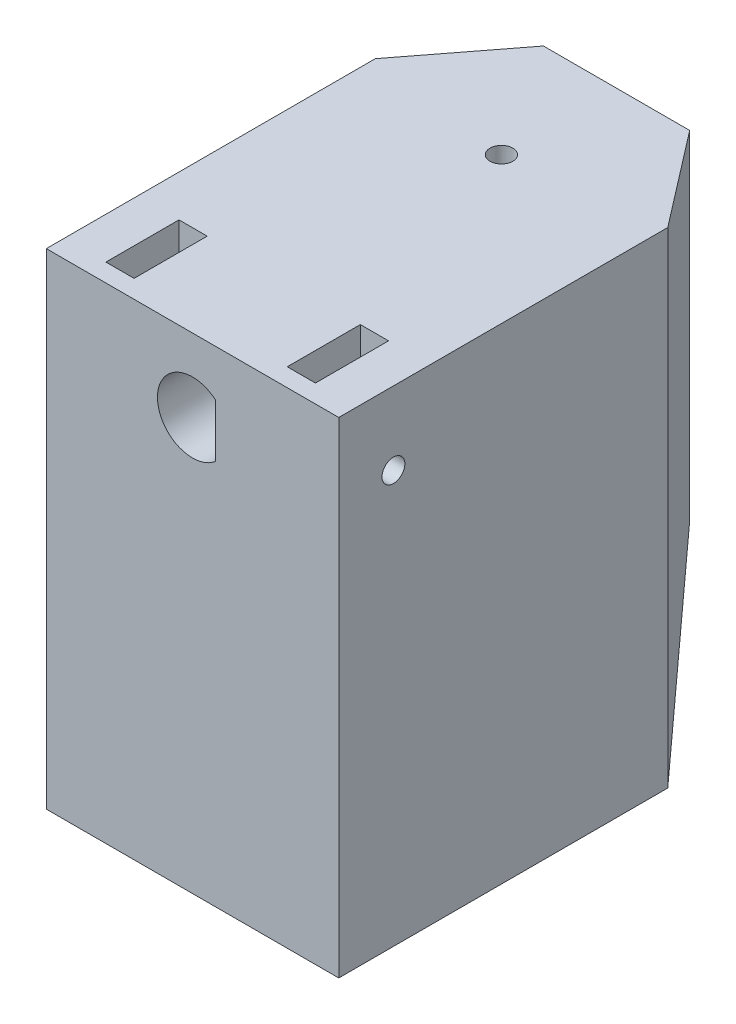
ISO-10303-21;
HEADER;
FILE_DESCRIPTION(('STEP AP214'),'2;1');
FILE_NAME('part.step','',(''),(''),'','','');
FILE_SCHEMA(('AUTOMOTIVE_DESIGN { 1 0 10303 214 1 1 1 1 }'));
ENDSEC;
DATA;
#1=APPLICATION_CONTEXT('core data for automotive mechanical design processes');
#2=APPLICATION_PROTOCOL_DEFINITION('international standard','automotive_design',2000,#1);
#3=PRODUCT_CONTEXT('',#1,'mechanical');
#4=PRODUCT('Part','Part','',(#3));
#5=PRODUCT_RELATED_PRODUCT_CATEGORY('part','',(#4));
#6=PRODUCT_DEFINITION_FORMATION('','',#4);
#7=PRODUCT_DEFINITION_CONTEXT('part definition',#1,'design');
#8=PRODUCT_DEFINITION('design','',#6,#7);
#9=PRODUCT_DEFINITION_SHAPE('','',#8);
#10=(LENGTH_UNIT() NAMED_UNIT(*) SI_UNIT(.MILLI.,.METRE.));
#11=(NAMED_UNIT(*) PLANE_ANGLE_UNIT() SI_UNIT($,.RADIAN.));
#12=(NAMED_UNIT(*) SI_UNIT($,.STERADIAN.) SOLID_ANGLE_UNIT());
#13=UNCERTAINTY_MEASURE_WITH_UNIT(LENGTH_MEASURE(1.E-05),#10,'distance_accuracy_value','');
#14=(GEOMETRIC_REPRESENTATION_CONTEXT(3) GLOBAL_UNCERTAINTY_ASSIGNED_CONTEXT((#13)) GLOBAL_UNIT_ASSIGNED_CONTEXT((#10,
#11,#12)) REPRESENTATION_CONTEXT('',''));
#15=CARTESIAN_POINT('',(0.,0.,0.));
#16=DIRECTION('',(0.,0.,1.));
#17=DIRECTION('',(1.,0.,0.));
#18=AXIS2_PLACEMENT_3D('',#15,#16,#17);
#19=CARTESIAN_POINT('',(-12.7,0.,20.65));
#20=DIRECTION('',(1.,0.,0.));
#21=DIRECTION('',(0.,1.,0.));
#22=AXIS2_PLACEMENT_3D('',#19,#20,#21);
#23=CYLINDRICAL_SURFACE('',#22,0.992187500000001);
#24=CARTESIAN_POINT('',(12.7,0.,20.65));
#25=DIRECTION('',(1.,0.,0.));
#26=DIRECTION('',(0.,1.,0.));
#27=AXIS2_PLACEMENT_3D('',#24,#25,#26);
#28=CIRCLE('',#27,0.992187500000001);
#29=CARTESIAN_POINT('',(12.7,0.9921875,20.65));
#30=VERTEX_POINT('',#29);
#31=EDGE_CURVE('E302',#30,#30,#28,.T.);
#32=ORIENTED_EDGE('',*,*,#31,.T.);
#33=EDGE_LOOP('',(#32));
#34=FACE_BOUND('',#33,.T.);
#35=CARTESIAN_POINT('',(9.1,0.,20.65));
#36=DIRECTION('',(-1.,0.,0.));
#37=DIRECTION('',(0.,-1.,0.));
#38=AXIS2_PLACEMENT_3D('',#35,#36,#37);
#39=CIRCLE('',#38,0.992187500000001);
#40=CARTESIAN_POINT('',(9.1,-0.992187500000002,20.65));
#41=VERTEX_POINT('',#40);
#42=EDGE_CURVE('E273',#41,#41,#39,.F.);
#43=ORIENTED_EDGE('',*,*,#42,.F.);
#44=EDGE_LOOP('',(#43));
#45=FACE_BOUND('',#44,.T.);
#46=ADVANCED_FACE('F45',(#34,#45),#23,.F.);
#47=CARTESIAN_POINT('',(-2.88410540113286,0.992187500000002,20.65));
#48=CARTESIAN_POINT('',(-2.88410544227333,0.992187499003058,20.5958755878596));
#49=CARTESIAN_POINT('',(-2.88564564639046,0.987743722350948,20.5417506382407));
#50=CARTESIAN_POINT('',(-2.89160993282774,0.970142380682304,20.4350990117294));
#51=CARTESIAN_POINT('',(-2.89603460657639,0.956983028624878,20.382572664925));
#52=CARTESIAN_POINT('',(-2.90721478367813,0.9224574538793,20.2806796461713));
#53=CARTESIAN_POINT('',(-2.91396589215871,0.901106697031612,20.231307223122));
#54=CARTESIAN_POINT('',(-2.9290319786145,0.850856739146813,20.1368299867803));
#55=CARTESIAN_POINT('',(-2.93734727535555,0.821955999031484,20.0917260461827));
#56=CARTESIAN_POINT('',(-2.9549521826214,0.756273448351369,20.0053861005485));
#57=CARTESIAN_POINT('',(-2.96426522492773,0.719258279234333,19.9643323552998));
#58=CARTESIAN_POINT('',(-2.98261770503291,0.638896136400684,19.8888916689228));
#59=CARTESIAN_POINT('',(-2.99165710103225,0.595548201185811,19.8545057420117));
#60=CARTESIAN_POINT('',(-3.00871380936081,0.502427251127224,19.7925587352875));
#61=CARTESIAN_POINT('',(-3.0167003384296,0.452521916038908,19.7651873408911));
#62=CARTESIAN_POINT('',(-3.03047632711017,0.348511403507998,19.7192990230443));
#63=CARTESIAN_POINT('',(-3.03626634888515,0.294407304951968,19.7007798336886));
#64=CARTESIAN_POINT('',(-3.04483101893703,0.185445026179661,19.6737359446256));
#65=CARTESIAN_POINT('',(-3.04769955823871,0.130671786084561,19.6648992986927));
#66=CARTESIAN_POINT('',(-3.05043068306615,0.0203499392450614,19.6564808338436));
#67=CARTESIAN_POINT('',(-3.05029400739354,-0.0351984735751725,19.6568967402816));
#68=CARTESIAN_POINT('',(-3.0470944150492,-0.143290758343074,19.666770826713));
#69=CARTESIAN_POINT('',(-3.04414106581474,-0.195869326720329,19.6758904452371));
#70=CARTESIAN_POINT('',(-3.03577642928814,-0.29870448299637,19.7023549170762));
#71=CARTESIAN_POINT('',(-3.03036497761968,-0.348960915363425,19.7197003204628));
#72=CARTESIAN_POINT('',(-3.01754969538778,-0.446481451629172,19.762329366313));
#73=CARTESIAN_POINT('',(-3.01012123264766,-0.493698981992226,19.787711842417));
#74=CARTESIAN_POINT('',(-2.99404888515526,-0.583306681132967,19.8456139413294));
#75=CARTESIAN_POINT('',(-2.98540467425785,-0.625695548998711,19.8781354806301));
#76=CARTESIAN_POINT('',(-2.96735674542788,-0.70645869874627,19.9511113505771));
#77=CARTESIAN_POINT('',(-2.95793635367576,-0.744566714529424,19.9918566550682));
#78=CARTESIAN_POINT('',(-2.93972858620891,-0.813492417156689,20.079243071153));
#79=CARTESIAN_POINT('',(-2.93094129875284,-0.844309088904597,20.125885002286));
#80=CARTESIAN_POINT('',(-2.91490614917664,-0.898122497898674,20.2245483616709));
#81=CARTESIAN_POINT('',(-2.90767979567869,-0.921012314136455,20.2766318669199));
#82=CARTESIAN_POINT('',(-2.89583486325815,-0.957608885594126,20.384207331038));
#83=CARTESIAN_POINT('',(-2.89121525345138,-0.971319271387314,20.4396979328688));
#84=CARTESIAN_POINT('',(-2.88533839154562,-0.988636876075504,20.5499440962319));
#85=CARTESIAN_POINT('',(-2.88394451250796,-0.992654948014235,20.6046278604142));
#86=CARTESIAN_POINT('',(-2.8842960294371,-0.991633602094448,20.7138948529574));
#87=CARTESIAN_POINT('',(-2.8860408894609,-0.986595730547893,20.7684780968891));
#88=CARTESIAN_POINT('',(-2.89233758463267,-0.967973922785001,20.8741654016898));
#89=CARTESIAN_POINT('',(-2.89679730050704,-0.954670167050479,20.9253248990449));
#90=CARTESIAN_POINT('',(-2.90792133337228,-0.920227585952964,21.0246770677459));
#91=CARTESIAN_POINT('',(-2.91458602922495,-0.899087414054148,21.0728692275519));
#92=CARTESIAN_POINT('',(-2.92962148534836,-0.848836779921624,21.1665496003867));
#93=CARTESIAN_POINT('',(-2.93803814987854,-0.819502534057743,21.2119102118481));
#94=CARTESIAN_POINT('',(-2.95553781207988,-0.75395301969471,21.2972141663049));
#95=CARTESIAN_POINT('',(-2.96462099666982,-0.717735816377705,21.3371559806382));
#96=CARTESIAN_POINT('',(-2.98292990249764,-0.637491602148098,21.4123641680929));
#97=CARTESIAN_POINT('',(-2.99214332635973,-0.59318436675287,21.4473353824276));
#98=CARTESIAN_POINT('',(-3.00926515954649,-0.499105057262503,21.5093625245216));
#99=CARTESIAN_POINT('',(-3.01717362119701,-0.449333202418803,21.5364187696857));
#100=CARTESIAN_POINT('',(-3.03075393221121,-0.346011052220623,21.5815943846169));
#101=CARTESIAN_POINT('',(-3.03644103658824,-0.292489615811174,21.5997749313711));
#102=CARTESIAN_POINT('',(-3.04500428742759,-0.182928910247626,21.6268078899542));
#103=CARTESIAN_POINT('',(-3.04788139509713,-0.126890508929983,21.6356634916205));
#104=CARTESIAN_POINT('',(-3.05043138226181,-0.0165929138099596,21.6435189137842));
#105=CARTESIAN_POINT('',(-3.05024234265781,0.0376331799160615,21.6429434407334));
#106=CARTESIAN_POINT('',(-3.04701763207516,0.145180388094265,21.6329926260583));
#107=CARTESIAN_POINT('',(-3.04398217379008,0.198501569861303,21.6236179419395));
#108=CARTESIAN_POINT('',(-3.03545367873891,0.301958416561305,21.596612386453));
#109=CARTESIAN_POINT('',(-3.02999695832424,0.352129088549445,21.5791033457476));
#110=CARTESIAN_POINT('',(-3.01718794133522,0.448842066153531,21.5364377169793));
#111=CARTESIAN_POINT('',(-3.00983530798857,0.495383725230549,21.5112797700936));
#112=CARTESIAN_POINT('',(-2.993668126611,0.585333264955752,21.4529913889707));
#113=CARTESIAN_POINT('',(-2.98481065485261,0.628569233327403,21.4196077131159));
#114=CARTESIAN_POINT('',(-2.96674391771869,0.708965129504234,21.3462524336054));
#115=CARTESIAN_POINT('',(-2.95753454352048,0.746123158692438,21.3062787791824));
#116=CARTESIAN_POINT('',(-2.93940150193374,0.814693001372457,21.2191195210637));
#117=CARTESIAN_POINT('',(-2.93050078175049,0.845843372263712,21.1717228223373));
#118=CARTESIAN_POINT('',(-2.91441536585923,0.899709614139127,21.072093321709));
#119=CARTESIAN_POINT('',(-2.90723012287973,0.922428176324609,21.0198620695248));
#120=CARTESIAN_POINT('',(-2.89584504366131,0.957550476466852,20.9153043833237));
#121=CARTESIAN_POINT('',(-2.89148992748762,0.97049854817774,20.8631778210159));
#122=CARTESIAN_POINT('',(-2.88562051672608,0.987815759147561,20.7573673637509));
#123=CARTESIAN_POINT('',(-2.88410536032719,0.992187500988832,20.7036839462584));
#124=CARTESIAN_POINT('',(-2.88410540113286,0.992187500000002,20.65));
#125=B_SPLINE_CURVE_WITH_KNOTS('',3,(#47,#48,#49,#50,#51,#52,#53,#54,#55,#56,#57,#58,#59,#60,
#61,#62,#63,#64,#65,#66,#67,#68,#69,#70,#71,#72,#73,#74,#75,#76,#77,#78,#79,#80,#81,#82,#83,#84,
#85,#86,#87,#88,#89,#90,#91,#92,#93,#94,#95,#96,#97,#98,#99,#100,#101,#102,#103,#104,#105,#106,
#107,#108,#109,#110,#111,#112,#113,#114,#115,#116,#117,#118,#119,#120,#121,#122,#123,#124),
.UNSPECIFIED.,.T.,.F.,(4,2,2,2,2,2,2,2,2,2,2,2,2,2,2,2,2,2,2,2,2,2,2,2,2,2,2,2,2,2,2,2,2,2,2,2,
2,2,4),(0.,0.162174630996264,0.32438252456463,0.486285655638667,0.648221816758152,
0.815631303538281,0.983066234419227,1.15463942416469,1.32616867264438,1.49199254632288,
1.65777565433925,1.81736215241872,1.97695932381421,2.13860074566675,2.30028561358634,
2.46924159712235,2.63822108877886,2.80939836914192,2.98050790680865,3.14422583660701,
3.30791581405046,3.46633914965661,3.62478971986229,3.78808146355611,3.95141917707508,
4.12218357997324,4.29294113396466,4.46250449013404,4.63200982393432,4.79390371610393,
4.95578551200371,5.11531727100793,5.27487738729246,5.44015156575835,5.60547727411764,
5.77688035855631,5.94822868870398,6.10913237387438,6.26998722348073),.UNSPECIFIED.);
#126=CARTESIAN_POINT('',(-2.88410540113286,0.992187500000002,20.65));
#127=VERTEX_POINT('',#126);
#128=EDGE_CURVE('E309',#127,#127,#125,.T.);
#129=ORIENTED_EDGE('',*,*,#128,.F.);
#130=EDGE_LOOP('',(#129));
#131=FACE_BOUND('',#130,.T.);
#132=CARTESIAN_POINT('',(-6.65,0.,20.65));
#133=DIRECTION('',(-1.,0.,0.));
#134=DIRECTION('',(0.,-1.,0.));
#135=AXIS2_PLACEMENT_3D('',#132,#133,#134);
#136=CIRCLE('',#135,0.992187500000001);
#137=CARTESIAN_POINT('',(-6.65,-0.9921875,20.65));
#138=VERTEX_POINT('',#137);
#139=EDGE_CURVE('E294',#138,#138,#136,.F.);
#140=ORIENTED_EDGE('',*,*,#139,.F.);
#141=EDGE_LOOP('',(#140));
#142=FACE_BOUND('',#141,.T.);
#143=ADVANCED_FACE('F395',(#131,#142),#23,.F.);
#144=CARTESIAN_POINT('',(12.7,0.,25.4));
#145=DIRECTION('',(1.,0.,0.));
#146=DIRECTION('',(0.,1.,0.));
#147=AXIS2_PLACEMENT_3D('',#144,#145,#146);
#148=PLANE('',#147);
#149=ORIENTED_EDGE('',*,*,#31,.F.);
#150=EDGE_LOOP('',(#149));
#151=FACE_BOUND('',#150,.T.);
#152=DIRECTION('',(0.,-1.,0.));
#153=VECTOR('',#152,1.);
#154=CARTESIAN_POINT('',(12.7,6.351,-3.175));
#155=LINE('',#154,#153);
#156=CARTESIAN_POINT('',(12.7,6.35,-3.175));
#157=VERTEX_POINT('',#156);
#158=CARTESIAN_POINT('',(12.7,-35.814,-3.175));
#159=VERTEX_POINT('',#158);
#160=EDGE_CURVE('E457',#157,#159,#155,.T.);
#161=ORIENTED_EDGE('',*,*,#160,.F.);
#162=DIRECTION('',(0.,0.,1.));
#163=VECTOR('',#162,1.);
#164=CARTESIAN_POINT('',(12.7,6.35,-11.43));
#165=LINE('',#164,#163);
#166=CARTESIAN_POINT('',(12.7,6.35,25.4));
#167=VERTEX_POINT('',#166);
#168=EDGE_CURVE('E445',#157,#167,#165,.T.);
#169=ORIENTED_EDGE('',*,*,#168,.T.);
#170=DIRECTION('',(0.,-1.,0.));
#171=VECTOR('',#170,1.);
#172=CARTESIAN_POINT('',(12.7,0.,25.4));
#173=LINE('',#172,#171);
#174=CARTESIAN_POINT('',(12.7,-35.814,25.4));
#175=VERTEX_POINT('',#174);
#176=EDGE_CURVE('E424',#167,#175,#173,.T.);
#177=ORIENTED_EDGE('',*,*,#176,.T.);
#178=DIRECTION('',(0.,0.,-1.));
#179=VECTOR('',#178,1.);
#180=CARTESIAN_POINT('',(12.7,-35.814,25.4));
#181=LINE('',#180,#179);
#182=EDGE_CURVE('E54',#175,#159,#181,.T.);
#183=ORIENTED_EDGE('',*,*,#182,.T.);
#184=EDGE_LOOP('',(#161,#169,#177,#183));
#185=FACE_BOUND('',#184,.T.);
#186=ADVANCED_FACE('F47',(#151,#185),#148,.T.);
#187=CARTESIAN_POINT('',(0.,6.35,25.4));
#188=DIRECTION('',(0.,1.,0.));
#189=DIRECTION('',(-1.,0.,0.));
#190=AXIS2_PLACEMENT_3D('',#187,#188,#189);
#191=PLANE('',#190);
#192=DIRECTION('',(1.,0.,0.));
#193=VECTOR('',#192,1.);
#194=CARTESIAN_POINT('',(-9.1,6.35,23.824999999988));
#195=LINE('',#194,#193);
#196=CARTESIAN_POINT('',(-9.1,6.35,23.824999999988));
#197=VERTEX_POINT('',#196);
#198=CARTESIAN_POINT('',(-6.65000000000001,6.35,23.824999999988));
#199=VERTEX_POINT('',#198);
#200=EDGE_CURVE('E213',#197,#199,#195,.T.);
#201=ORIENTED_EDGE('',*,*,#200,.F.);
#202=DIRECTION('',(0.,0.,1.));
#203=VECTOR('',#202,1.);
#204=CARTESIAN_POINT('',(-9.1,6.35,17.4749999999904));
#205=LINE('',#204,#203);
#206=CARTESIAN_POINT('',(-9.1,6.35,17.4749999999904));
#207=VERTEX_POINT('',#206);
#208=EDGE_CURVE('E222',#207,#197,#205,.T.);
#209=ORIENTED_EDGE('',*,*,#208,.F.);
#210=DIRECTION('',(-1.,0.,0.));
#211=VECTOR('',#210,1.);
#212=CARTESIAN_POINT('',(-9.1,6.35,17.4749999999904));
#213=LINE('',#212,#211);
#214=CARTESIAN_POINT('',(-6.65000000000001,6.35,17.4749999999904));
#215=VERTEX_POINT('',#214);
#216=EDGE_CURVE('E234',#215,#207,#213,.T.);
#217=ORIENTED_EDGE('',*,*,#216,.F.);
#218=DIRECTION('',(0.,0.,-1.));
#219=VECTOR('',#218,1.);
#220=CARTESIAN_POINT('',(-6.65000000000001,6.35,17.4749999999904));
#221=LINE('',#220,#219);
#222=EDGE_CURVE('E232',#199,#215,#221,.T.);
#223=ORIENTED_EDGE('',*,*,#222,.F.);
#224=EDGE_LOOP('',(#201,#209,#217,#223));
#225=FACE_BOUND('',#224,.T.);
#226=DIRECTION('',(1.,0.,0.));
#227=VECTOR('',#226,1.);
#228=CARTESIAN_POINT('',(6.65,6.35,23.8249999998175));
#229=LINE('',#228,#227);
#230=CARTESIAN_POINT('',(6.65,6.35,23.8249999998175));
#231=VERTEX_POINT('',#230);
#232=CARTESIAN_POINT('',(9.1,6.35,23.8249999998175));
#233=VERTEX_POINT('',#232);
#234=EDGE_CURVE('E241',#231,#233,#229,.T.);
#235=ORIENTED_EDGE('',*,*,#234,.F.);
#236=DIRECTION('',(0.,0.,1.));
#237=VECTOR('',#236,1.);
#238=CARTESIAN_POINT('',(6.65,6.35,17.4749999999904));
#239=LINE('',#238,#237);
#240=CARTESIAN_POINT('',(6.65,6.35,17.4749999999904));
#241=VERTEX_POINT('',#240);
#242=EDGE_CURVE('E239',#241,#231,#239,.T.);
#243=ORIENTED_EDGE('',*,*,#242,.F.);
#244=DIRECTION('',(-1.,0.,0.));
#245=VECTOR('',#244,1.);
#246=CARTESIAN_POINT('',(6.65,6.35,17.4749999999904));
#247=LINE('',#246,#245);
#248=CARTESIAN_POINT('',(9.1,6.35,17.4749999999904));
#249=VERTEX_POINT('',#248);
#250=EDGE_CURVE('E227',#249,#241,#247,.T.);
#251=ORIENTED_EDGE('',*,*,#250,.F.);
#252=DIRECTION('',(0.,0.,-1.));
#253=VECTOR('',#252,1.);
#254=CARTESIAN_POINT('',(9.1,6.35,17.4749999999904));
#255=LINE('',#254,#253);
#256=EDGE_CURVE('E244',#233,#249,#255,.T.);
#257=ORIENTED_EDGE('',*,*,#256,.F.);
#258=EDGE_LOOP('',(#235,#243,#251,#257));
#259=FACE_BOUND('',#258,.T.);
#260=CARTESIAN_POINT('',(0.,6.35,-1.43));
#261=DIRECTION('',(0.,1.,0.));
#262=DIRECTION('',(-1.,0.,0.));
#263=AXIS2_PLACEMENT_3D('',#260,#261,#262);
#264=CIRCLE('',#263,0.9921875);
#265=CARTESIAN_POINT('',(-0.992187500000001,6.35,-1.43));
#266=VERTEX_POINT('',#265);
#267=EDGE_CURVE('E298',#266,#266,#264,.T.);
#268=ORIENTED_EDGE('',*,*,#267,.F.);
#269=EDGE_LOOP('',(#268));
#270=FACE_BOUND('',#269,.T.);
#271=DIRECTION('',(0.,0.,1.));
#272=VECTOR('',#271,1.);
#273=CARTESIAN_POINT('',(-12.7,6.35,-11.43));
#274=LINE('',#273,#272);
#275=CARTESIAN_POINT('',(-12.7,6.35,-3.175));
#276=VERTEX_POINT('',#275);
#277=CARTESIAN_POINT('',(-12.7,6.35,25.4));
#278=VERTEX_POINT('',#277);
#279=EDGE_CURVE('E439',#276,#278,#274,.T.);
#280=ORIENTED_EDGE('',*,*,#279,.T.);
#281=DIRECTION('',(1.,0.,0.));
#282=VECTOR('',#281,1.);
#283=CARTESIAN_POINT('',(0.,6.35,25.4));
#284=LINE('',#283,#282);
#285=EDGE_CURVE('E421',#278,#167,#284,.T.);
#286=ORIENTED_EDGE('',*,*,#285,.T.);
#287=ORIENTED_EDGE('',*,*,#168,.F.);
#288=DIRECTION('',(-0.609710760849693,0.,-0.7926239891046));
#289=VECTOR('',#288,1.);
#290=CARTESIAN_POINT('',(6.35,6.35,-11.43));
#291=LINE('',#290,#289);
#292=CARTESIAN_POINT('',(6.35,6.35,-11.43));
#293=VERTEX_POINT('',#292);
#294=EDGE_CURVE('E460',#157,#293,#291,.T.);
#295=ORIENTED_EDGE('',*,*,#294,.T.);
#296=DIRECTION('',(1.,0.,0.));
#297=VECTOR('',#296,1.);
#298=CARTESIAN_POINT('',(12.7,6.35,-11.43));
#299=LINE('',#298,#297);
#300=CARTESIAN_POINT('',(-6.35,6.35,-11.43));
#301=VERTEX_POINT('',#300);
#302=EDGE_CURVE('E447',#301,#293,#299,.T.);
#303=ORIENTED_EDGE('',*,*,#302,.F.);
#304=DIRECTION('',(-0.609710760849693,0.,0.7926239891046));
#305=VECTOR('',#304,1.);
#306=CARTESIAN_POINT('',(-12.7,6.35,-3.175));
#307=LINE('',#306,#305);
#308=EDGE_CURVE('E454',#301,#276,#307,.T.);
#309=ORIENTED_EDGE('',*,*,#308,.T.);
#310=EDGE_LOOP('',(#280,#286,#287,#295,#303,#309));
#311=FACE_BOUND('',#310,.T.);
#312=ADVANCED_FACE('F229',(#225,#259,#270,#311),#191,.T.);
#313=CARTESIAN_POINT('',(-12.7,0.,25.4));
#314=DIRECTION('',(1.,0.,0.));
#315=DIRECTION('',(0.,1.,0.));
#316=AXIS2_PLACEMENT_3D('',#313,#314,#315);
#317=PLANE('',#316);
#318=CARTESIAN_POINT('',(-12.7,0.,20.65));
#319=DIRECTION('',(1.,0.,0.));
#320=DIRECTION('',(0.,1.,0.));
#321=AXIS2_PLACEMENT_3D('',#318,#319,#320);
#322=CIRCLE('',#321,0.992187500000001);
#323=CARTESIAN_POINT('',(-12.7,0.992187500000003,20.65));
#324=VERTEX_POINT('',#323);
#325=EDGE_CURVE('E303',#324,#324,#322,.T.);
#326=ORIENTED_EDGE('',*,*,#325,.T.);
#327=EDGE_LOOP('',(#326));
#328=FACE_BOUND('',#327,.T.);
#329=ORIENTED_EDGE('',*,*,#279,.F.);
#330=DIRECTION('',(0.,-1.,0.));
#331=VECTOR('',#330,1.);
#332=CARTESIAN_POINT('',(-12.7,6.351,-3.175));
#333=LINE('',#332,#331);
#334=CARTESIAN_POINT('',(-12.7,-35.814,-3.175));
#335=VERTEX_POINT('',#334);
#336=EDGE_CURVE('E471',#276,#335,#333,.T.);
#337=ORIENTED_EDGE('',*,*,#336,.T.);
#338=DIRECTION('',(0.,0.,-1.));
#339=VECTOR('',#338,1.);
#340=CARTESIAN_POINT('',(-12.7,-35.814,25.4));
#341=LINE('',#340,#339);
#342=CARTESIAN_POINT('',(-12.7,-35.814,25.4));
#343=VERTEX_POINT('',#342);
#344=EDGE_CURVE('E13',#343,#335,#341,.T.);
#345=ORIENTED_EDGE('',*,*,#344,.F.);
#346=DIRECTION('',(0.,-1.,0.));
#347=VECTOR('',#346,1.);
#348=CARTESIAN_POINT('',(-12.7,0.,25.4));
#349=LINE('',#348,#347);
#350=EDGE_CURVE('E419',#278,#343,#349,.T.);
#351=ORIENTED_EDGE('',*,*,#350,.F.);
#352=EDGE_LOOP('',(#329,#337,#345,#351));
#353=FACE_BOUND('',#352,.T.);
#354=ADVANCED_FACE('F531',(#328,#353),#317,.F.);
#355=CARTESIAN_POINT('',(0.,-35.814,25.4));
#356=DIRECTION('',(0.,1.,0.));
#357=DIRECTION('',(0.,0.,1.));
#358=AXIS2_PLACEMENT_3D('',#355,#356,#357);
#359=PLANE('',#358);
#360=DIRECTION('',(0.,0.,1.));
#361=VECTOR('',#360,1.);
#362=CARTESIAN_POINT('',(9.525,-35.814,22.225));
#363=LINE('',#362,#361);
#364=CARTESIAN_POINT('',(9.525,-35.814,3.175));
#365=VERTEX_POINT('',#364);
#366=CARTESIAN_POINT('',(9.525,-35.814,22.225));
#367=VERTEX_POINT('',#366);
#368=EDGE_CURVE('E517',#365,#367,#363,.T.);
#369=ORIENTED_EDGE('',*,*,#368,.F.);
#370=DIRECTION('',(1.,0.,0.));
#371=VECTOR('',#370,1.);
#372=CARTESIAN_POINT('',(-9.525,-35.814,3.175));
#373=LINE('',#372,#371);
#374=CARTESIAN_POINT('',(-9.525,-35.814,3.175));
#375=VERTEX_POINT('',#374);
#376=EDGE_CURVE('E515',#375,#365,#373,.T.);
#377=ORIENTED_EDGE('',*,*,#376,.F.);
#378=DIRECTION('',(0.,0.,-1.));
#379=VECTOR('',#378,1.);
#380=CARTESIAN_POINT('',(-9.525,-35.814,22.225));
#381=LINE('',#380,#379);
#382=CARTESIAN_POINT('',(-9.525,-35.814,22.225));
#383=VERTEX_POINT('',#382);
#384=EDGE_CURVE('E317',#383,#375,#381,.T.);
#385=ORIENTED_EDGE('',*,*,#384,.F.);
#386=DIRECTION('',(-1.,0.,0.));
#387=VECTOR('',#386,1.);
#388=CARTESIAN_POINT('',(-9.525,-35.814,22.225));
#389=LINE('',#388,#387);
#390=EDGE_CURVE('E318',#367,#383,#389,.T.);
#391=ORIENTED_EDGE('',*,*,#390,.F.);
#392=EDGE_LOOP('',(#369,#377,#385,#391));
#393=FACE_BOUND('',#392,.T.);
#394=ORIENTED_EDGE('',*,*,#344,.T.);
#395=DIRECTION('',(1.,0.,0.));
#396=VECTOR('',#395,1.);
#397=CARTESIAN_POINT('',(-14.2885,-35.814,-3.175));
#398=LINE('',#397,#396);
#399=EDGE_CURVE('E450',#335,#159,#398,.T.);
#400=ORIENTED_EDGE('',*,*,#399,.T.);
#401=ORIENTED_EDGE('',*,*,#182,.F.);
#402=DIRECTION('',(1.,0.,0.));
#403=VECTOR('',#402,1.);
#404=CARTESIAN_POINT('',(0.,-35.814,25.4));
#405=LINE('',#404,#403);
#406=EDGE_CURVE('E417',#343,#175,#405,.T.);
#407=ORIENTED_EDGE('',*,*,#406,.F.);
#408=EDGE_LOOP('',(#394,#400,#401,#407));
#409=FACE_BOUND('',#408,.T.);
#410=ADVANCED_FACE('F527',(#393,#409),#359,.F.);
#411=CARTESIAN_POINT('',(0.,0.,25.4));
#412=DIRECTION('',(0.,0.,1.));
#413=DIRECTION('',(1.,0.,0.));
#414=AXIS2_PLACEMENT_3D('',#411,#412,#413);
#415=PLANE('',#414);
#416=ORIENTED_EDGE('',*,*,#285,.F.);
#417=ORIENTED_EDGE('',*,*,#350,.T.);
#418=ORIENTED_EDGE('',*,*,#406,.T.);
#419=ORIENTED_EDGE('',*,*,#176,.F.);
#420=EDGE_LOOP('',(#416,#417,#418,#419));
#421=FACE_BOUND('',#420,.T.);
#422=CARTESIAN_POINT('',(0.,0.,25.4));
#423=DIRECTION('',(0.,0.,1.));
#424=DIRECTION('',(1.,0.,0.));
#425=AXIS2_PLACEMENT_3D('',#422,#423,#424);
#426=CIRCLE('',#425,3.05);
#427=CARTESIAN_POINT('',(2.00312256240101,2.3,25.4));
#428=VERTEX_POINT('',#427);
#429=CARTESIAN_POINT('',(2.00312256240101,-2.3,25.4));
#430=VERTEX_POINT('',#429);
#431=EDGE_CURVE('E437',#428,#430,#426,.T.);
#432=ORIENTED_EDGE('',*,*,#431,.F.);
#433=DIRECTION('',(0.,1.,0.));
#434=VECTOR('',#433,1.);
#435=CARTESIAN_POINT('',(2.00312256240101,2.3,25.4));
#436=LINE('',#435,#434);
#437=EDGE_CURVE('E433',#430,#428,#436,.T.);
#438=ORIENTED_EDGE('',*,*,#437,.F.);
#439=EDGE_LOOP('',(#432,#438));
#440=FACE_BOUND('',#439,.T.);
#441=ADVANCED_FACE('F390',(#421,#440),#415,.T.);
#442=CARTESIAN_POINT('',(0.,0.,15.9));
#443=DIRECTION('',(0.,0.,1.));
#444=DIRECTION('',(1.,0.,0.));
#445=AXIS2_PLACEMENT_3D('',#442,#443,#444);
#446=CYLINDRICAL_SURFACE('',#445,3.05);
#447=ORIENTED_EDGE('',*,*,#128,.T.);
#448=EDGE_LOOP('',(#447));
#449=FACE_BOUND('',#448,.T.);
#450=ORIENTED_EDGE('',*,*,#431,.T.);
#451=DIRECTION('',(0.,0.,1.));
#452=VECTOR('',#451,1.);
#453=CARTESIAN_POINT('',(2.00312256240101,-2.3,15.9));
#454=LINE('',#453,#452);
#455=CARTESIAN_POINT('',(2.00312256240101,-2.3,15.9));
#456=VERTEX_POINT('',#455);
#457=EDGE_CURVE('E428',#456,#430,#454,.T.);
#458=ORIENTED_EDGE('',*,*,#457,.F.);
#459=CARTESIAN_POINT('',(0.,0.,15.9));
#460=DIRECTION('',(0.,0.,1.));
#461=DIRECTION('',(1.,0.,0.));
#462=AXIS2_PLACEMENT_3D('',#459,#460,#461);
#463=CIRCLE('',#462,3.05);
#464=CARTESIAN_POINT('',(2.00312256240101,2.3,15.9));
#465=VERTEX_POINT('',#464);
#466=EDGE_CURVE('E436',#465,#456,#463,.T.);
#467=ORIENTED_EDGE('',*,*,#466,.F.);
#468=DIRECTION('',(0.,0.,1.));
#469=VECTOR('',#468,1.);
#470=CARTESIAN_POINT('',(2.00312256240101,2.3,15.9));
#471=LINE('',#470,#469);
#472=EDGE_CURVE('E427',#465,#428,#471,.T.);
#473=ORIENTED_EDGE('',*,*,#472,.T.);
#474=EDGE_LOOP('',(#450,#458,#467,#473));
#475=FACE_BOUND('',#474,.T.);
#476=ADVANCED_FACE('F320',(#449,#475),#446,.F.);
#477=CARTESIAN_POINT('',(2.00312256240101,2.3,15.9));
#478=DIRECTION('',(1.,0.,0.));
#479=DIRECTION('',(0.,0.,-1.));
#480=AXIS2_PLACEMENT_3D('',#477,#478,#479);
#481=PLANE('',#480);
#482=CARTESIAN_POINT('',(2.00312256240101,0.,20.65));
#483=DIRECTION('',(1.,0.,0.));
#484=DIRECTION('',(0.,0.,-1.));
#485=AXIS2_PLACEMENT_3D('',#482,#483,#484);
#486=CIRCLE('',#485,0.992187500000001);
#487=CARTESIAN_POINT('',(2.00312256240101,0.,19.6578125));
#488=VERTEX_POINT('',#487);
#489=EDGE_CURVE('E306',#488,#488,#486,.T.);
#490=ORIENTED_EDGE('',*,*,#489,.T.);
#491=EDGE_LOOP('',(#490));
#492=FACE_BOUND('',#491,.T.);
#493=ORIENTED_EDGE('',*,*,#437,.T.);
#494=ORIENTED_EDGE('',*,*,#472,.F.);
#495=DIRECTION('',(0.,1.,0.));
#496=VECTOR('',#495,1.);
#497=CARTESIAN_POINT('',(2.00312256240101,2.3,15.9));
#498=LINE('',#497,#496);
#499=EDGE_CURVE('E431',#456,#465,#498,.T.);
#500=ORIENTED_EDGE('',*,*,#499,.F.);
#501=ORIENTED_EDGE('',*,*,#457,.T.);
#502=EDGE_LOOP('',(#493,#494,#500,#501));
#503=FACE_BOUND('',#502,.T.);
#504=ADVANCED_FACE('F383',(#492,#503),#481,.F.);
#505=CARTESIAN_POINT('',(0.,0.,15.9));
#506=DIRECTION('',(0.,0.,1.));
#507=DIRECTION('',(1.,0.,0.));
#508=AXIS2_PLACEMENT_3D('',#505,#506,#507);
#509=PLANE('',#508);
#510=ORIENTED_EDGE('',*,*,#466,.T.);
#511=ORIENTED_EDGE('',*,*,#499,.T.);
#512=EDGE_LOOP('',(#510,#511));
#513=FACE_BOUND('',#512,.T.);
#514=ADVANCED_FACE('F380',(#513),#509,.T.);
#515=CARTESIAN_POINT('',(0.,0.,-11.43));
#516=DIRECTION('',(0.,0.,-1.));
#517=DIRECTION('',(-1.,0.,0.));
#518=AXIS2_PLACEMENT_3D('',#515,#516,#517);
#519=PLANE('',#518);
#520=CARTESIAN_POINT('',(0.,0.,-11.43));
#521=DIRECTION('',(0.,0.,-1.));
#522=DIRECTION('',(-1.,0.,0.));
#523=AXIS2_PLACEMENT_3D('',#520,#521,#522);
#524=CIRCLE('',#523,3.302);
#525=CARTESIAN_POINT('',(1.651,2.85961588329622,-11.43));
#526=VERTEX_POINT('',#525);
#527=CARTESIAN_POINT('',(-1.651,2.85961588329622,-11.43));
#528=VERTEX_POINT('',#527);
#529=EDGE_CURVE('E486',#526,#528,#524,.T.);
#530=ORIENTED_EDGE('',*,*,#529,.F.);
#531=DIRECTION('',(1.,0.,0.));
#532=VECTOR('',#531,1.);
#533=CARTESIAN_POINT('',(1.651,2.85961588329622,-11.43));
#534=LINE('',#533,#532);
#535=EDGE_CURVE('E482',#528,#526,#534,.T.);
#536=ORIENTED_EDGE('',*,*,#535,.F.);
#537=EDGE_LOOP('',(#530,#536));
#538=FACE_BOUND('',#537,.T.);
#539=DIRECTION('',(0.,-1.,0.));
#540=VECTOR('',#539,1.);
#541=CARTESIAN_POINT('',(-6.35,6.351,-11.43));
#542=LINE('',#541,#540);
#543=CARTESIAN_POINT('',(-6.35,-23.01875,-11.43));
#544=VERTEX_POINT('',#543);
#545=EDGE_CURVE('E472',#301,#544,#542,.T.);
#546=ORIENTED_EDGE('',*,*,#545,.F.);
#547=ORIENTED_EDGE('',*,*,#302,.T.);
#548=DIRECTION('',(0.,-1.,0.));
#549=VECTOR('',#548,1.);
#550=CARTESIAN_POINT('',(6.35,6.351,-11.43));
#551=LINE('',#550,#549);
#552=CARTESIAN_POINT('',(6.35,-23.01875,-11.43));
#553=VERTEX_POINT('',#552);
#554=EDGE_CURVE('E459',#293,#553,#551,.T.);
#555=ORIENTED_EDGE('',*,*,#554,.T.);
#556=DIRECTION('',(1.,0.,0.));
#557=VECTOR('',#556,1.);
#558=CARTESIAN_POINT('',(-14.2885,-23.01875,-11.43));
#559=LINE('',#558,#557);
#560=EDGE_CURVE('E451',#544,#553,#559,.T.);
#561=ORIENTED_EDGE('',*,*,#560,.F.);
#562=EDGE_LOOP('',(#546,#547,#555,#561));
#563=FACE_BOUND('',#562,.T.);
#564=ADVANCED_FACE('F376',(#538,#563),#519,.T.);
#565=CARTESIAN_POINT('',(-14.2885,-35.814,-3.175));
#566=DIRECTION('',(0.,0.542126869822093,0.840296648224244));
#567=DIRECTION('',(0.,-0.840296648224244,0.542126869822093));
#568=AXIS2_PLACEMENT_3D('',#565,#566,#567);
#569=PLANE('',#568);
#570=ORIENTED_EDGE('',*,*,#399,.F.);
#571=DIRECTION('',(-0.38489376461713,-0.775560935703517,0.500361894002269));
#572=VECTOR('',#571,1.);
#573=CARTESIAN_POINT('',(-0.113386220459314,-10.4519732342255,-19.5375979134029));
#574=LINE('',#573,#572);
#575=EDGE_CURVE('E463',#544,#335,#574,.T.);
#576=ORIENTED_EDGE('',*,*,#575,.F.);
#577=ORIENTED_EDGE('',*,*,#560,.T.);
#578=DIRECTION('',(-0.384893764617131,0.775560935703517,-0.500361894002269));
#579=VECTOR('',#578,1.);
#580=CARTESIAN_POINT('',(-2.41712202185854,-5.35299912595507,-22.8272586284161));
#581=LINE('',#580,#579);
#582=EDGE_CURVE('E466',#159,#553,#581,.T.);
#583=ORIENTED_EDGE('',*,*,#582,.F.);
#584=EDGE_LOOP('',(#570,#576,#577,#583));
#585=FACE_BOUND('',#584,.T.);
#586=ADVANCED_FACE('F372',(#585),#569,.F.);
#587=CARTESIAN_POINT('',(6.35,6.351,-11.43));
#588=DIRECTION('',(-0.7926239891046,0.,0.609710760849693));
#589=DIRECTION('',(0.609710760849693,0.,0.7926239891046));
#590=AXIS2_PLACEMENT_3D('',#587,#588,#589);
#591=PLANE('',#590);
#592=ORIENTED_EDGE('',*,*,#160,.T.);
#593=ORIENTED_EDGE('',*,*,#582,.T.);
#594=ORIENTED_EDGE('',*,*,#554,.F.);
#595=ORIENTED_EDGE('',*,*,#294,.F.);
#596=EDGE_LOOP('',(#592,#593,#594,#595));
#597=FACE_BOUND('',#596,.T.);
#598=ADVANCED_FACE('F368',(#597),#591,.F.);
#599=CARTESIAN_POINT('',(-12.7,6.351,-3.175));
#600=DIRECTION('',(0.7926239891046,0.,0.609710760849693));
#601=DIRECTION('',(0.609710760849693,0.,-0.7926239891046));
#602=AXIS2_PLACEMENT_3D('',#599,#600,#601);
#603=PLANE('',#602);
#604=ORIENTED_EDGE('',*,*,#545,.T.);
#605=ORIENTED_EDGE('',*,*,#575,.T.);
#606=ORIENTED_EDGE('',*,*,#336,.F.);
#607=ORIENTED_EDGE('',*,*,#308,.F.);
#608=EDGE_LOOP('',(#604,#605,#606,#607));
#609=FACE_BOUND('',#608,.T.);
#610=ADVANCED_FACE('F364',(#609),#603,.F.);
#611=CARTESIAN_POINT('',(0.,0.,8.57));
#612=DIRECTION('',(0.,0.,-1.));
#613=DIRECTION('',(-1.,0.,0.));
#614=AXIS2_PLACEMENT_3D('',#611,#612,#613);
#615=CYLINDRICAL_SURFACE('',#614,3.302);
#616=ORIENTED_EDGE('',*,*,#529,.T.);
#617=DIRECTION('',(0.,0.,-1.));
#618=VECTOR('',#617,1.);
#619=CARTESIAN_POINT('',(-1.651,2.85961588329622,8.57));
#620=LINE('',#619,#618);
#621=CARTESIAN_POINT('',(-1.651,2.85961588329622,8.57));
#622=VERTEX_POINT('',#621);
#623=EDGE_CURVE('E477',#622,#528,#620,.T.);
#624=ORIENTED_EDGE('',*,*,#623,.F.);
#625=CARTESIAN_POINT('',(0.,0.,8.57));
#626=DIRECTION('',(0.,0.,-1.));
#627=DIRECTION('',(-1.,0.,0.));
#628=AXIS2_PLACEMENT_3D('',#625,#626,#627);
#629=CIRCLE('',#628,3.302);
#630=CARTESIAN_POINT('',(1.651,2.85961588329622,8.57));
#631=VERTEX_POINT('',#630);
#632=EDGE_CURVE('E485',#631,#622,#629,.T.);
#633=ORIENTED_EDGE('',*,*,#632,.F.);
#634=DIRECTION('',(0.,0.,-1.));
#635=VECTOR('',#634,1.);
#636=CARTESIAN_POINT('',(1.651,2.85961588329622,8.57));
#637=LINE('',#636,#635);
#638=EDGE_CURVE('E468',#631,#526,#637,.T.);
#639=ORIENTED_EDGE('',*,*,#638,.T.);
#640=EDGE_LOOP('',(#616,#624,#633,#639));
#641=FACE_BOUND('',#640,.T.);
#642=ADVANCED_FACE('F360',(#641),#615,.F.);
#643=CARTESIAN_POINT('',(1.651,2.85961588329622,8.57));
#644=DIRECTION('',(0.,1.,0.));
#645=DIRECTION('',(0.,0.,1.));
#646=AXIS2_PLACEMENT_3D('',#643,#644,#645);
#647=PLANE('',#646);
#648=CARTESIAN_POINT('',(0.,2.85961588329622,-1.43));
#649=DIRECTION('',(0.,1.,0.));
#650=DIRECTION('',(0.,0.,1.));
#651=AXIS2_PLACEMENT_3D('',#648,#649,#650);
#652=CIRCLE('',#651,0.9921875);
#653=CARTESIAN_POINT('',(0.,2.85961588329622,-0.437812499999999));
#654=VERTEX_POINT('',#653);
#655=EDGE_CURVE('E295',#654,#654,#652,.F.);
#656=ORIENTED_EDGE('',*,*,#655,.F.);
#657=EDGE_LOOP('',(#656));
#658=FACE_BOUND('',#657,.T.);
#659=ORIENTED_EDGE('',*,*,#535,.T.);
#660=ORIENTED_EDGE('',*,*,#638,.F.);
#661=DIRECTION('',(1.,0.,0.));
#662=VECTOR('',#661,1.);
#663=CARTESIAN_POINT('',(1.651,2.85961588329622,8.57));
#664=LINE('',#663,#662);
#665=EDGE_CURVE('E480',#622,#631,#664,.T.);
#666=ORIENTED_EDGE('',*,*,#665,.F.);
#667=ORIENTED_EDGE('',*,*,#623,.T.);
#668=EDGE_LOOP('',(#659,#660,#666,#667));
#669=FACE_BOUND('',#668,.T.);
#670=ADVANCED_FACE('F356',(#658,#669),#647,.F.);
#671=CARTESIAN_POINT('',(0.,0.,8.57));
#672=DIRECTION('',(0.,0.,-1.));
#673=DIRECTION('',(-1.,0.,0.));
#674=AXIS2_PLACEMENT_3D('',#671,#672,#673);
#675=PLANE('',#674);
#676=ORIENTED_EDGE('',*,*,#632,.T.);
#677=ORIENTED_EDGE('',*,*,#665,.T.);
#678=EDGE_LOOP('',(#676,#677));
#679=FACE_BOUND('',#678,.T.);
#680=ADVANCED_FACE('F352',(#679),#675,.T.);
#681=CARTESIAN_POINT('',(0.,-9.52499999999996,25.4));
#682=DIRECTION('',(0.,1.,0.));
#683=DIRECTION('',(-1.,0.,0.));
#684=AXIS2_PLACEMENT_3D('',#681,#682,#683);
#685=PLANE('',#684);
#686=DIRECTION('',(0.,0.,-1.));
#687=VECTOR('',#686,1.);
#688=CARTESIAN_POINT('',(-9.525,-9.52499999999993,22.225));
#689=LINE('',#688,#687);
#690=CARTESIAN_POINT('',(-9.525,-9.52499999999993,22.225));
#691=VERTEX_POINT('',#690);
#692=CARTESIAN_POINT('',(-9.525,-9.52499999999993,3.175));
#693=VERTEX_POINT('',#692);
#694=EDGE_CURVE('E494',#691,#693,#689,.T.);
#695=ORIENTED_EDGE('',*,*,#694,.T.);
#696=DIRECTION('',(1.,0.,0.));
#697=VECTOR('',#696,1.);
#698=CARTESIAN_POINT('',(-9.5250000000001,-9.52499999999993,3.175));
#699=LINE('',#698,#697);
#700=CARTESIAN_POINT('',(9.525,-9.52499999999996,3.175));
#701=VERTEX_POINT('',#700);
#702=EDGE_CURVE('E498',#693,#701,#699,.T.);
#703=ORIENTED_EDGE('',*,*,#702,.T.);
#704=DIRECTION('',(0.,0.,1.));
#705=VECTOR('',#704,1.);
#706=CARTESIAN_POINT('',(9.525,-9.52499999999999,22.225));
#707=LINE('',#706,#705);
#708=CARTESIAN_POINT('',(9.525,-9.52499999999999,22.225));
#709=VERTEX_POINT('',#708);
#710=EDGE_CURVE('E497',#701,#709,#707,.T.);
#711=ORIENTED_EDGE('',*,*,#710,.T.);
#712=DIRECTION('',(-1.,0.,0.));
#713=VECTOR('',#712,1.);
#714=CARTESIAN_POINT('',(-9.5250000000001,-9.52499999999993,22.225));
#715=LINE('',#714,#713);
#716=EDGE_CURVE('E501',#709,#691,#715,.T.);
#717=ORIENTED_EDGE('',*,*,#716,.T.);
#718=EDGE_LOOP('',(#695,#703,#711,#717));
#719=FACE_BOUND('',#718,.T.);
#720=ADVANCED_FACE('F348',(#719),#685,.F.);
#721=CARTESIAN_POINT('',(-9.525,20.5907683632075,3.175));
#722=DIRECTION('',(0.,0.,-1.));
#723=DIRECTION('',(-1.,0.,0.));
#724=AXIS2_PLACEMENT_3D('',#721,#722,#723);
#725=PLANE('',#724);
#726=DIRECTION('',(0.,-1.,0.));
#727=VECTOR('',#726,1.);
#728=CARTESIAN_POINT('',(-9.525,20.5907683632075,3.175));
#729=LINE('',#728,#727);
#730=EDGE_CURVE('E488',#693,#375,#729,.T.);
#731=ORIENTED_EDGE('',*,*,#730,.T.);
#732=ORIENTED_EDGE('',*,*,#376,.T.);
#733=DIRECTION('',(0.,-1.,0.));
#734=VECTOR('',#733,1.);
#735=CARTESIAN_POINT('',(9.525,20.5907683632075,3.175));
#736=LINE('',#735,#734);
#737=EDGE_CURVE('E495',#701,#365,#736,.T.);
#738=ORIENTED_EDGE('',*,*,#737,.F.);
#739=ORIENTED_EDGE('',*,*,#702,.F.);
#740=EDGE_LOOP('',(#731,#732,#738,#739));
#741=FACE_BOUND('',#740,.T.);
#742=ADVANCED_FACE('F344',(#741),#725,.F.);
#743=CARTESIAN_POINT('',(9.525,20.5907683632075,22.225));
#744=DIRECTION('',(1.,0.,0.));
#745=DIRECTION('',(0.,0.,-1.));
#746=AXIS2_PLACEMENT_3D('',#743,#744,#745);
#747=PLANE('',#746);
#748=ORIENTED_EDGE('',*,*,#737,.T.);
#749=ORIENTED_EDGE('',*,*,#368,.T.);
#750=DIRECTION('',(0.,-1.,0.));
#751=VECTOR('',#750,1.);
#752=CARTESIAN_POINT('',(9.525,20.5907683632075,22.225));
#753=LINE('',#752,#751);
#754=EDGE_CURVE('E499',#709,#367,#753,.T.);
#755=ORIENTED_EDGE('',*,*,#754,.F.);
#756=ORIENTED_EDGE('',*,*,#710,.F.);
#757=EDGE_LOOP('',(#748,#749,#755,#756));
#758=FACE_BOUND('',#757,.T.);
#759=ADVANCED_FACE('F340',(#758),#747,.F.);
#760=CARTESIAN_POINT('',(-9.525,20.5907683632075,22.225));
#761=DIRECTION('',(0.,0.,1.));
#762=DIRECTION('',(1.,0.,0.));
#763=AXIS2_PLACEMENT_3D('',#760,#761,#762);
#764=PLANE('',#763);
#765=ORIENTED_EDGE('',*,*,#754,.T.);
#766=ORIENTED_EDGE('',*,*,#390,.T.);
#767=DIRECTION('',(0.,-1.,0.));
#768=VECTOR('',#767,1.);
#769=CARTESIAN_POINT('',(-9.525,20.5907683632075,22.225));
#770=LINE('',#769,#768);
#771=EDGE_CURVE('E502',#691,#383,#770,.T.);
#772=ORIENTED_EDGE('',*,*,#771,.F.);
#773=ORIENTED_EDGE('',*,*,#716,.F.);
#774=EDGE_LOOP('',(#765,#766,#772,#773));
#775=FACE_BOUND('',#774,.T.);
#776=ADVANCED_FACE('F336',(#775),#764,.F.);
#777=CARTESIAN_POINT('',(-9.525,20.5907683632075,22.225));
#778=DIRECTION('',(-1.,0.,0.));
#779=DIRECTION('',(0.,0.,1.));
#780=AXIS2_PLACEMENT_3D('',#777,#778,#779);
#781=PLANE('',#780);
#782=ORIENTED_EDGE('',*,*,#771,.T.);
#783=ORIENTED_EDGE('',*,*,#384,.T.);
#784=ORIENTED_EDGE('',*,*,#730,.F.);
#785=ORIENTED_EDGE('',*,*,#694,.F.);
#786=EDGE_LOOP('',(#782,#783,#784,#785));
#787=FACE_BOUND('',#786,.T.);
#788=ADVANCED_FACE('F333',(#787),#781,.F.);
#789=CARTESIAN_POINT('',(6.65,0.,20.65));
#790=DIRECTION('',(-1.,0.,0.));
#791=DIRECTION('',(0.,-1.,0.));
#792=AXIS2_PLACEMENT_3D('',#789,#790,#791);
#793=CIRCLE('',#792,0.992187500000001);
#794=CARTESIAN_POINT('',(6.65,-0.992187500000002,20.65));
#795=VERTEX_POINT('',#794);
#796=EDGE_CURVE('E49',#795,#795,#793,.F.);
#797=ORIENTED_EDGE('',*,*,#796,.T.);
#798=EDGE_LOOP('',(#797));
#799=FACE_BOUND('',#798,.T.);
#800=ORIENTED_EDGE('',*,*,#489,.F.);
#801=EDGE_LOOP('',(#800));
#802=FACE_BOUND('',#801,.T.);
#803=ADVANCED_FACE('F330',(#799,#802),#23,.F.);
#804=CARTESIAN_POINT('',(-9.1,0.,20.65));
#805=DIRECTION('',(-1.,0.,0.));
#806=DIRECTION('',(0.,-1.,0.));
#807=AXIS2_PLACEMENT_3D('',#804,#805,#806);
#808=CIRCLE('',#807,0.992187500000001);
#809=CARTESIAN_POINT('',(-9.1,-0.9921875,20.65));
#810=VERTEX_POINT('',#809);
#811=EDGE_CURVE('E299',#810,#810,#808,.F.);
#812=ORIENTED_EDGE('',*,*,#811,.T.);
#813=EDGE_LOOP('',(#812));
#814=FACE_BOUND('',#813,.T.);
#815=ORIENTED_EDGE('',*,*,#325,.F.);
#816=EDGE_LOOP('',(#815));
#817=FACE_BOUND('',#816,.T.);
#818=ADVANCED_FACE('F324',(#814,#817),#23,.F.);
#819=CARTESIAN_POINT('',(0.,-35.815,-1.43));
#820=DIRECTION('',(0.,1.,0.));
#821=DIRECTION('',(-1.,0.,0.));
#822=AXIS2_PLACEMENT_3D('',#819,#820,#821);
#823=CYLINDRICAL_SURFACE('',#822,0.9921875);
#824=ORIENTED_EDGE('',*,*,#267,.T.);
#825=EDGE_LOOP('',(#824));
#826=FACE_BOUND('',#825,.T.);
#827=ORIENTED_EDGE('',*,*,#655,.T.);
#828=EDGE_LOOP('',(#827));
#829=FACE_BOUND('',#828,.T.);
#830=ADVANCED_FACE('F329',(#826,#829),#823,.F.);
#831=CARTESIAN_POINT('',(-9.1,0.,0.));
#832=DIRECTION('',(-1.,0.,0.));
#833=DIRECTION('',(0.,-1.,0.));
#834=AXIS2_PLACEMENT_3D('',#831,#832,#833);
#835=PLANE('',#834);
#836=DIRECTION('',(0.,0.5,0.866025403784439));
#837=VECTOR('',#836,1.);
#838=CARTESIAN_POINT('',(-9.09999999996318,-246109.845696189,-426247.756988736));
#839=LINE('',#838,#837);
#840=CARTESIAN_POINT('',(-9.1,-3.6661742093429,20.6500000000744));
#841=VERTEX_POINT('',#840);
#842=CARTESIAN_POINT('',(-9.1,-1.83308710461461,23.824999999988));
#843=VERTEX_POINT('',#842);
#844=EDGE_CURVE('E219',#841,#843,#839,.T.);
#845=ORIENTED_EDGE('',*,*,#844,.F.);
#846=DIRECTION('',(0.,-0.5,0.866025403784439));
#847=VECTOR('',#846,1.);
#848=CARTESIAN_POINT('',(-9.10000000001501,100308.575534875,-173725.249261264));
#849=LINE('',#848,#847);
#850=CARTESIAN_POINT('',(-9.1,-1.83308710465724,17.4750000000472));
#851=VERTEX_POINT('',#850);
#852=EDGE_CURVE('E277',#851,#841,#849,.T.);
#853=ORIENTED_EDGE('',*,*,#852,.F.);
#854=DIRECTION('',(0.,-1.,0.));
#855=VECTOR('',#854,1.);
#856=CARTESIAN_POINT('',(-9.09999999995638,-291591.5418,17.4749999999904));
#857=LINE('',#856,#855);
#858=EDGE_CURVE('E62',#207,#851,#857,.T.);
#859=ORIENTED_EDGE('',*,*,#858,.F.);
#860=ORIENTED_EDGE('',*,*,#208,.T.);
#861=DIRECTION('',(0.,1.,0.));
#862=VECTOR('',#861,1.);
#863=CARTESIAN_POINT('',(-9.09999999995638,-291591.5418,23.824999999988));
#864=LINE('',#863,#862);
#865=EDGE_CURVE('E210',#843,#197,#864,.T.);
#866=ORIENTED_EDGE('',*,*,#865,.F.);
#867=EDGE_LOOP('',(#845,#853,#859,#860,#866));
#868=FACE_BOUND('',#867,.T.);
#869=ORIENTED_EDGE('',*,*,#811,.F.);
#870=EDGE_LOOP('',(#869));
#871=FACE_BOUND('',#870,.T.);
#872=ADVANCED_FACE('F223',(#868,#871),#835,.F.);
#873=CARTESIAN_POINT('',(-6.65,0.,0.));
#874=DIRECTION('',(-1.,0.,0.));
#875=DIRECTION('',(0.,-1.,0.));
#876=AXIS2_PLACEMENT_3D('',#873,#874,#875);
#877=PLANE('',#876);
#878=DIRECTION('',(0.,0.5,0.866025403784439));
#879=VECTOR('',#878,1.);
#880=CARTESIAN_POINT('',(-6.64999999996318,-246109.845696189,-426247.756988736));
#881=LINE('',#880,#879);
#882=CARTESIAN_POINT('',(-6.65,-3.6661742093429,20.6500000000744));
#883=VERTEX_POINT('',#882);
#884=CARTESIAN_POINT('',(-6.65,-1.83308710461461,23.824999999988));
#885=VERTEX_POINT('',#884);
#886=EDGE_CURVE('E280',#883,#885,#881,.T.);
#887=ORIENTED_EDGE('',*,*,#886,.T.);
#888=DIRECTION('',(0.,1.,0.));
#889=VECTOR('',#888,1.);
#890=CARTESIAN_POINT('',(-6.64999999995638,-291591.5418,23.824999999988));
#891=LINE('',#890,#889);
#892=EDGE_CURVE('E283',#885,#199,#891,.T.);
#893=ORIENTED_EDGE('',*,*,#892,.T.);
#894=ORIENTED_EDGE('',*,*,#222,.T.);
#895=DIRECTION('',(0.,-1.,0.));
#896=VECTOR('',#895,1.);
#897=CARTESIAN_POINT('',(-6.64999999995638,-291591.5418,17.4749999999904));
#898=LINE('',#897,#896);
#899=CARTESIAN_POINT('',(-6.65,-1.83308710465724,17.4750000000472));
#900=VERTEX_POINT('',#899);
#901=EDGE_CURVE('E285',#215,#900,#898,.T.);
#902=ORIENTED_EDGE('',*,*,#901,.T.);
#903=DIRECTION('',(0.,-0.5,0.866025403784439));
#904=VECTOR('',#903,1.);
#905=CARTESIAN_POINT('',(-6.65000000001501,100308.575534875,-173725.249261264));
#906=LINE('',#905,#904);
#907=EDGE_CURVE('E274',#900,#883,#906,.T.);
#908=ORIENTED_EDGE('',*,*,#907,.T.);
#909=EDGE_LOOP('',(#887,#893,#894,#902,#908));
#910=FACE_BOUND('',#909,.T.);
#911=ORIENTED_EDGE('',*,*,#139,.T.);
#912=EDGE_LOOP('',(#911));
#913=FACE_BOUND('',#912,.T.);
#914=ADVANCED_FACE('F695',(#910,#913),#877,.T.);
#915=CARTESIAN_POINT('',(-9.09999999996318,-246109.845696189,-426247.756988736));
#916=DIRECTION('',(0.,0.866025403784439,-0.5));
#917=DIRECTION('',(0.,0.5,0.866025403784439));
#918=AXIS2_PLACEMENT_3D('',#915,#916,#917);
#919=PLANE('',#918);
#920=ORIENTED_EDGE('',*,*,#886,.F.);
#921=DIRECTION('',(1.,0.,0.));
#922=VECTOR('',#921,1.);
#923=CARTESIAN_POINT('',(-9.1,-3.6661742093429,20.6500000000744));
#924=LINE('',#923,#922);
#925=EDGE_CURVE('E279',#841,#883,#924,.T.);
#926=ORIENTED_EDGE('',*,*,#925,.F.);
#927=ORIENTED_EDGE('',*,*,#844,.T.);
#928=DIRECTION('',(1.,0.,0.));
#929=VECTOR('',#928,1.);
#930=CARTESIAN_POINT('',(-9.1,-1.83308710461461,23.824999999988));
#931=LINE('',#930,#929);
#932=EDGE_CURVE('E216',#843,#885,#931,.T.);
#933=ORIENTED_EDGE('',*,*,#932,.T.);
#934=EDGE_LOOP('',(#920,#926,#927,#933));
#935=FACE_BOUND('',#934,.T.);
#936=ADVANCED_FACE('F705',(#935),#919,.T.);
#937=CARTESIAN_POINT('',(-9.09999999995638,-291591.5418,23.824999999988));
#938=DIRECTION('',(0.,0.,-1.));
#939=DIRECTION('',(-1.,0.,0.));
#940=AXIS2_PLACEMENT_3D('',#937,#938,#939);
#941=PLANE('',#940);
#942=ORIENTED_EDGE('',*,*,#892,.F.);
#943=ORIENTED_EDGE('',*,*,#932,.F.);
#944=ORIENTED_EDGE('',*,*,#865,.T.);
#945=ORIENTED_EDGE('',*,*,#200,.T.);
#946=EDGE_LOOP('',(#942,#943,#944,#945));
#947=FACE_BOUND('',#946,.T.);
#948=ADVANCED_FACE('F211',(#947),#941,.T.);
#949=CARTESIAN_POINT('',(-9.09999999995638,-291591.5418,17.4749999999904));
#950=DIRECTION('',(0.,0.,1.));
#951=DIRECTION('',(1.,0.,0.));
#952=AXIS2_PLACEMENT_3D('',#949,#950,#951);
#953=PLANE('',#952);
#954=ORIENTED_EDGE('',*,*,#901,.F.);
#955=ORIENTED_EDGE('',*,*,#216,.T.);
#956=ORIENTED_EDGE('',*,*,#858,.T.);
#957=DIRECTION('',(1.,0.,0.));
#958=VECTOR('',#957,1.);
#959=CARTESIAN_POINT('',(-9.1,-1.83308710465724,17.4750000000472));
#960=LINE('',#959,#958);
#961=EDGE_CURVE('E290',#851,#900,#960,.T.);
#962=ORIENTED_EDGE('',*,*,#961,.T.);
#963=EDGE_LOOP('',(#954,#955,#956,#962));
#964=FACE_BOUND('',#963,.T.);
#965=ADVANCED_FACE('F723',(#964),#953,.T.);
#966=CARTESIAN_POINT('',(-9.10000000001501,100308.575534875,-173725.249261264));
#967=DIRECTION('',(0.,0.866025403784439,0.5));
#968=DIRECTION('',(0.,-0.5,0.866025403784439));
#969=AXIS2_PLACEMENT_3D('',#966,#967,#968);
#970=PLANE('',#969);
#971=ORIENTED_EDGE('',*,*,#907,.F.);
#972=ORIENTED_EDGE('',*,*,#961,.F.);
#973=ORIENTED_EDGE('',*,*,#852,.T.);
#974=ORIENTED_EDGE('',*,*,#925,.T.);
#975=EDGE_LOOP('',(#971,#972,#973,#974));
#976=FACE_BOUND('',#975,.T.);
#977=ADVANCED_FACE('F733',(#976),#970,.T.);
#978=CARTESIAN_POINT('',(6.65,0.,0.));
#979=DIRECTION('',(-1.,0.,0.));
#980=DIRECTION('',(0.,-1.,0.));
#981=AXIS2_PLACEMENT_3D('',#978,#979,#980);
#982=PLANE('',#981);
#983=DIRECTION('',(0.,0.5,0.866025403784439));
#984=VECTOR('',#983,1.);
#985=CARTESIAN_POINT('',(6.65000000001501,100300.315817586,173752.243011264));
#986=LINE('',#985,#984);
#987=CARTESIAN_POINT('',(6.65,-3.66617420925763,20.6499999998755));
#988=VERTEX_POINT('',#987);
#989=CARTESIAN_POINT('',(6.65,-1.83308710467145,23.824999999988));
#990=VERTEX_POINT('',#989);
#991=EDGE_CURVE('E248',#988,#990,#986,.T.);
#992=ORIENTED_EDGE('',*,*,#991,.F.);
#993=DIRECTION('',(0.,-0.5,0.866025403784439));
#994=VECTOR('',#993,1.);
#995=CARTESIAN_POINT('',(6.64999999996318,-246101.5859789,426274.750738736));
#996=LINE('',#995,#994);
#997=CARTESIAN_POINT('',(6.65,-1.83308710461461,17.4749999999335));
#998=VERTEX_POINT('',#997);
#999=EDGE_CURVE('E255',#998,#988,#996,.T.);
#1000=ORIENTED_EDGE('',*,*,#999,.F.);
#1001=DIRECTION('',(0.,-1.,0.));
#1002=VECTOR('',#1001,1.);
#1003=CARTESIAN_POINT('',(6.64999999995638,-291591.5418,17.4749999999904));
#1004=LINE('',#1003,#1002);
#1005=EDGE_CURVE('E70',#241,#998,#1004,.T.);
#1006=ORIENTED_EDGE('',*,*,#1005,.F.);
#1007=ORIENTED_EDGE('',*,*,#242,.T.);
#1008=DIRECTION('',(0.,1.,0.));
#1009=VECTOR('',#1008,1.);
#1010=CARTESIAN_POINT('',(6.64999999995638,-291591.5418,23.824999999988));
#1011=LINE('',#1010,#1009);
#1012=EDGE_CURVE('E251',#990,#231,#1011,.T.);
#1013=ORIENTED_EDGE('',*,*,#1012,.F.);
#1014=EDGE_LOOP('',(#992,#1000,#1006,#1007,#1013));
#1015=FACE_BOUND('',#1014,.T.);
#1016=ORIENTED_EDGE('',*,*,#796,.F.);
#1017=EDGE_LOOP('',(#1016));
#1018=FACE_BOUND('',#1017,.T.);
#1019=ADVANCED_FACE('F743',(#1015,#1018),#982,.F.);
#1020=CARTESIAN_POINT('',(9.1,0.,0.));
#1021=DIRECTION('',(-1.,0.,0.));
#1022=DIRECTION('',(0.,-1.,0.));
#1023=AXIS2_PLACEMENT_3D('',#1020,#1021,#1022);
#1024=PLANE('',#1023);
#1025=DIRECTION('',(0.,0.5,0.866025403784439));
#1026=VECTOR('',#1025,1.);
#1027=CARTESIAN_POINT('',(9.10000000001501,100300.315817586,173752.243011264));
#1028=LINE('',#1027,#1026);
#1029=CARTESIAN_POINT('',(9.1,-3.66617420925763,20.6499999998755));
#1030=VERTEX_POINT('',#1029);
#1031=CARTESIAN_POINT('',(9.1,-1.83308710467145,23.824999999988));
#1032=VERTEX_POINT('',#1031);
#1033=EDGE_CURVE('E238',#1030,#1032,#1028,.T.);
#1034=ORIENTED_EDGE('',*,*,#1033,.T.);
#1035=DIRECTION('',(0.,1.,0.));
#1036=VECTOR('',#1035,1.);
#1037=CARTESIAN_POINT('',(9.09999999995638,-291591.5418,23.824999999988));
#1038=LINE('',#1037,#1036);
#1039=EDGE_CURVE('E260',#1032,#233,#1038,.T.);
#1040=ORIENTED_EDGE('',*,*,#1039,.T.);
#1041=ORIENTED_EDGE('',*,*,#256,.T.);
#1042=DIRECTION('',(0.,-1.,0.));
#1043=VECTOR('',#1042,1.);
#1044=CARTESIAN_POINT('',(9.09999999995638,-291591.5418,17.4749999999904));
#1045=LINE('',#1044,#1043);
#1046=CARTESIAN_POINT('',(9.1,-1.83308710461461,17.4749999999335));
#1047=VERTEX_POINT('',#1046);
#1048=EDGE_CURVE('E262',#249,#1047,#1045,.T.);
#1049=ORIENTED_EDGE('',*,*,#1048,.T.);
#1050=DIRECTION('',(0.,-0.5,0.866025403784439));
#1051=VECTOR('',#1050,1.);
#1052=CARTESIAN_POINT('',(9.09999999996318,-246101.5859789,426274.750738736));
#1053=LINE('',#1052,#1051);
#1054=EDGE_CURVE('E252',#1047,#1030,#1053,.T.);
#1055=ORIENTED_EDGE('',*,*,#1054,.T.);
#1056=EDGE_LOOP('',(#1034,#1040,#1041,#1049,#1055));
#1057=FACE_BOUND('',#1056,.T.);
#1058=ORIENTED_EDGE('',*,*,#42,.T.);
#1059=EDGE_LOOP('',(#1058));
#1060=FACE_BOUND('',#1059,.T.);
#1061=ADVANCED_FACE('F755',(#1057,#1060),#1024,.T.);
#1062=CARTESIAN_POINT('',(6.65000000001501,100300.315817586,173752.243011264));
#1063=DIRECTION('',(0.,0.866025403784439,-0.5));
#1064=DIRECTION('',(0.,0.5,0.866025403784439));
#1065=AXIS2_PLACEMENT_3D('',#1062,#1063,#1064);
#1066=PLANE('',#1065);
#1067=ORIENTED_EDGE('',*,*,#1033,.F.);
#1068=DIRECTION('',(1.,0.,0.));
#1069=VECTOR('',#1068,1.);
#1070=CARTESIAN_POINT('',(6.65,-3.66617420925763,20.6499999998755));
#1071=LINE('',#1070,#1069);
#1072=EDGE_CURVE('E257',#988,#1030,#1071,.T.);
#1073=ORIENTED_EDGE('',*,*,#1072,.F.);
#1074=ORIENTED_EDGE('',*,*,#991,.T.);
#1075=DIRECTION('',(1.,0.,0.));
#1076=VECTOR('',#1075,1.);
#1077=CARTESIAN_POINT('',(6.65,-1.83308710467145,23.824999999988));
#1078=LINE('',#1077,#1076);
#1079=EDGE_CURVE('E270',#990,#1032,#1078,.T.);
#1080=ORIENTED_EDGE('',*,*,#1079,.T.);
#1081=EDGE_LOOP('',(#1067,#1073,#1074,#1080));
#1082=FACE_BOUND('',#1081,.T.);
#1083=ADVANCED_FACE('F765',(#1082),#1066,.T.);
#1084=CARTESIAN_POINT('',(6.64999999995638,-291591.5418,23.824999999988));
#1085=DIRECTION('',(0.,0.,-1.));
#1086=DIRECTION('',(-1.,0.,0.));
#1087=AXIS2_PLACEMENT_3D('',#1084,#1085,#1086);
#1088=PLANE('',#1087);
#1089=ORIENTED_EDGE('',*,*,#1039,.F.);
#1090=ORIENTED_EDGE('',*,*,#1079,.F.);
#1091=ORIENTED_EDGE('',*,*,#1012,.T.);
#1092=ORIENTED_EDGE('',*,*,#234,.T.);
#1093=EDGE_LOOP('',(#1089,#1090,#1091,#1092));
#1094=FACE_BOUND('',#1093,.T.);
#1095=ADVANCED_FACE('F777',(#1094),#1088,.T.);
#1096=CARTESIAN_POINT('',(6.64999999995638,-291591.5418,17.4749999999904));
#1097=DIRECTION('',(0.,0.,1.));
#1098=DIRECTION('',(1.,0.,0.));
#1099=AXIS2_PLACEMENT_3D('',#1096,#1097,#1098);
#1100=PLANE('',#1099);
#1101=ORIENTED_EDGE('',*,*,#1048,.F.);
#1102=ORIENTED_EDGE('',*,*,#250,.T.);
#1103=ORIENTED_EDGE('',*,*,#1005,.T.);
#1104=DIRECTION('',(1.,0.,0.));
#1105=VECTOR('',#1104,1.);
#1106=CARTESIAN_POINT('',(6.65,-1.83308710461461,17.4749999999335));
#1107=LINE('',#1106,#1105);
#1108=EDGE_CURVE('E267',#998,#1047,#1107,.T.);
#1109=ORIENTED_EDGE('',*,*,#1108,.T.);
#1110=EDGE_LOOP('',(#1101,#1102,#1103,#1109));
#1111=FACE_BOUND('',#1110,.T.);
#1112=ADVANCED_FACE('F785',(#1111),#1100,.T.);
#1113=CARTESIAN_POINT('',(6.64999999996318,-246101.5859789,426274.750738736));
#1114=DIRECTION('',(0.,0.866025403784439,0.5));
#1115=DIRECTION('',(0.,-0.5,0.866025403784439));
#1116=AXIS2_PLACEMENT_3D('',#1113,#1114,#1115);
#1117=PLANE('',#1116);
#1118=ORIENTED_EDGE('',*,*,#1054,.F.);
#1119=ORIENTED_EDGE('',*,*,#1108,.F.);
#1120=ORIENTED_EDGE('',*,*,#999,.T.);
#1121=ORIENTED_EDGE('',*,*,#1072,.T.);
#1122=EDGE_LOOP('',(#1118,#1119,#1120,#1121));
#1123=FACE_BOUND('',#1122,.T.);
#1124=ADVANCED_FACE('F795',(#1123),#1117,.T.);
#1125=CLOSED_SHELL('',(#46,#143,#186,#312,#354,#410,#441,#476,#504,#514,#564,#586,#598,#610,
#642,#670,#680,#720,#742,#759,#776,#788,#803,#818,#830,#872,#914,#936,#948,#965,#977,#1019,
#1061,#1083,#1095,#1112,#1124));
#1126=MANIFOLD_SOLID_BREP('B2',#1125);
#1127=ADVANCED_BREP_SHAPE_REPRESENTATION('',(#18,#1126),#14);
#1128=SHAPE_DEFINITION_REPRESENTATION(#9,#1127);
ENDSEC;
END-ISO-10303-21;
